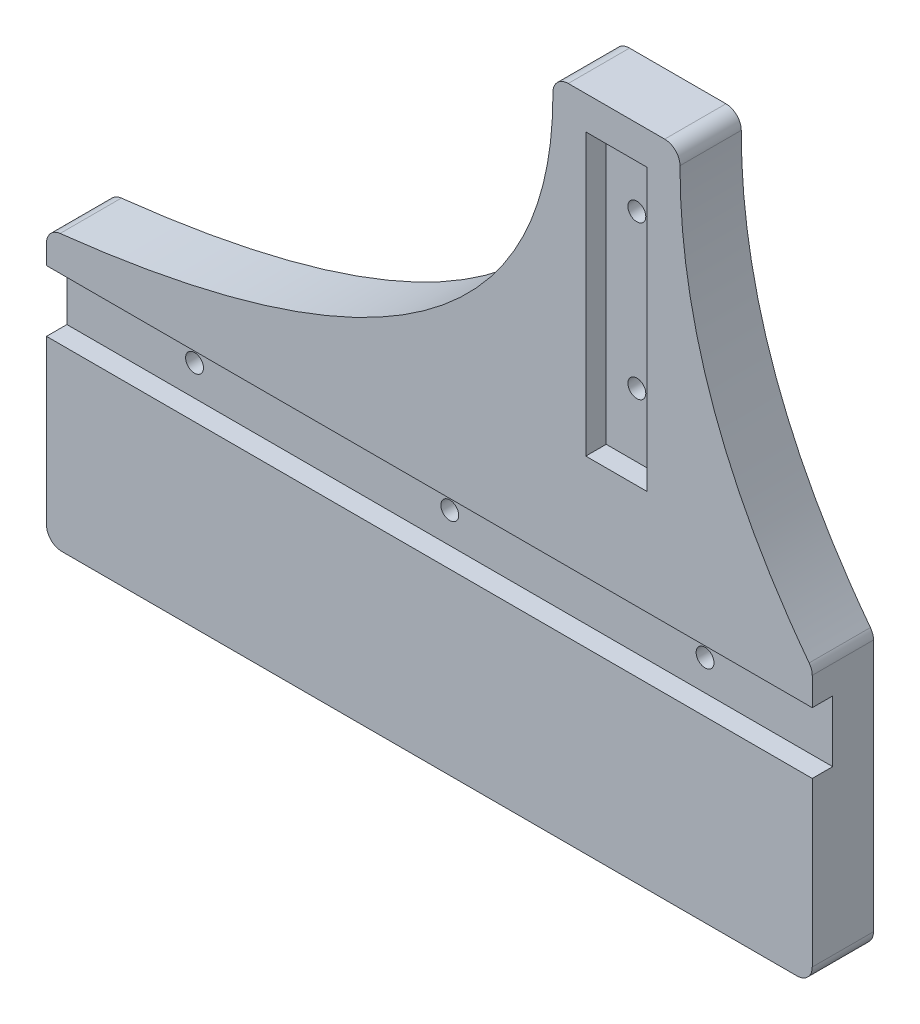
ISO-10303-21;
HEADER;
FILE_DESCRIPTION(('STEP AP214'),'2;1');
FILE_NAME('part.step','',(''),(''),'','','');
FILE_SCHEMA(('AUTOMOTIVE_DESIGN { 1 0 10303 214 1 1 1 1 }'));
ENDSEC;
DATA;
#1=APPLICATION_CONTEXT('core data for automotive mechanical design processes');
#2=APPLICATION_PROTOCOL_DEFINITION('international standard','automotive_design',2000,#1);
#3=PRODUCT_CONTEXT('',#1,'mechanical');
#4=PRODUCT('Part','Part','',(#3));
#5=PRODUCT_RELATED_PRODUCT_CATEGORY('part','',(#4));
#6=PRODUCT_DEFINITION_FORMATION('','',#4);
#7=PRODUCT_DEFINITION_CONTEXT('part definition',#1,'design');
#8=PRODUCT_DEFINITION('design','',#6,#7);
#9=PRODUCT_DEFINITION_SHAPE('','',#8);
#10=(LENGTH_UNIT() NAMED_UNIT(*) SI_UNIT(.MILLI.,.METRE.));
#11=(NAMED_UNIT(*) PLANE_ANGLE_UNIT() SI_UNIT($,.RADIAN.));
#12=(NAMED_UNIT(*) SI_UNIT($,.STERADIAN.) SOLID_ANGLE_UNIT());
#13=UNCERTAINTY_MEASURE_WITH_UNIT(LENGTH_MEASURE(1.E-05),#10,'distance_accuracy_value','');
#14=(GEOMETRIC_REPRESENTATION_CONTEXT(3) GLOBAL_UNCERTAINTY_ASSIGNED_CONTEXT((#13)) GLOBAL_UNIT_ASSIGNED_CONTEXT((#10,
#11,#12)) REPRESENTATION_CONTEXT('',''));
#15=CARTESIAN_POINT('',(0.,0.,0.));
#16=DIRECTION('',(0.,0.,1.));
#17=DIRECTION('',(1.,0.,0.));
#18=AXIS2_PLACEMENT_3D('',#15,#16,#17);
#19=CARTESIAN_POINT('',(36.64,69.,-12.));
#20=DIRECTION('',(0.,0.,1.));
#21=DIRECTION('',(1.,0.,0.));
#22=AXIS2_PLACEMENT_3D('',#19,#20,#21);
#23=CYLINDRICAL_SURFACE('',#22,1.75);
#24=CARTESIAN_POINT('',(36.64,69.,-12.));
#25=DIRECTION('',(0.,0.,1.));
#26=DIRECTION('',(1.,0.,0.));
#27=AXIS2_PLACEMENT_3D('',#24,#25,#26);
#28=CIRCLE('',#27,1.75);
#29=CARTESIAN_POINT('',(38.39,69.,-12.));
#30=VERTEX_POINT('',#29);
#31=EDGE_CURVE('E352',#30,#30,#28,.T.);
#32=ORIENTED_EDGE('',*,*,#31,.F.);
#33=EDGE_LOOP('',(#32));
#34=FACE_BOUND('',#33,.T.);
#35=CARTESIAN_POINT('',(36.64,69.,-4.));
#36=DIRECTION('',(0.,0.,1.));
#37=DIRECTION('',(1.,0.,0.));
#38=AXIS2_PLACEMENT_3D('',#35,#36,#37);
#39=CIRCLE('',#38,1.75);
#40=CARTESIAN_POINT('',(38.39,69.,-4.));
#41=VERTEX_POINT('',#40);
#42=EDGE_CURVE('E199',#41,#41,#39,.T.);
#43=ORIENTED_EDGE('',*,*,#42,.T.);
#44=EDGE_LOOP('',(#43));
#45=FACE_BOUND('',#44,.T.);
#46=ADVANCED_FACE('F37',(#34,#45),#23,.F.);
#47=CARTESIAN_POINT('',(36.64,39.,-12.));
#48=DIRECTION('',(0.,0.,1.));
#49=DIRECTION('',(1.,0.,0.));
#50=AXIS2_PLACEMENT_3D('',#47,#48,#49);
#51=CYLINDRICAL_SURFACE('',#50,1.75);
#52=CARTESIAN_POINT('',(36.64,39.,-12.));
#53=DIRECTION('',(0.,0.,1.));
#54=DIRECTION('',(1.,0.,0.));
#55=AXIS2_PLACEMENT_3D('',#52,#53,#54);
#56=CIRCLE('',#55,1.75);
#57=CARTESIAN_POINT('',(38.39,39.,-12.));
#58=VERTEX_POINT('',#57);
#59=EDGE_CURVE('E349',#58,#58,#56,.T.);
#60=ORIENTED_EDGE('',*,*,#59,.F.);
#61=EDGE_LOOP('',(#60));
#62=FACE_BOUND('',#61,.T.);
#63=CARTESIAN_POINT('',(36.64,39.,-4.));
#64=DIRECTION('',(0.,0.,1.));
#65=DIRECTION('',(1.,0.,0.));
#66=AXIS2_PLACEMENT_3D('',#63,#64,#65);
#67=CIRCLE('',#66,1.75);
#68=CARTESIAN_POINT('',(38.39,39.,-4.));
#69=VERTEX_POINT('',#68);
#70=EDGE_CURVE('E202',#69,#69,#67,.T.);
#71=ORIENTED_EDGE('',*,*,#70,.T.);
#72=EDGE_LOOP('',(#71));
#73=FACE_BOUND('',#72,.T.);
#74=ADVANCED_FACE('F303',(#62,#73),#51,.F.);
#75=CARTESIAN_POINT('',(0.,0.,0.));
#76=DIRECTION('',(0.,0.,1.));
#77=DIRECTION('',(1.,0.,0.));
#78=AXIS2_PLACEMENT_3D('',#75,#76,#77);
#79=PLANE('',#78);
#80=DIRECTION('',(0.,-1.,0.));
#81=VECTOR('',#80,1.);
#82=CARTESIAN_POINT('',(75.,0.,0.));
#83=LINE('',#82,#81);
#84=CARTESIAN_POINT('',(75.,11.4873755573327,0.));
#85=VERTEX_POINT('',#84);
#86=CARTESIAN_POINT('',(75.,6.00000000000002,0.));
#87=VERTEX_POINT('',#86);
#88=EDGE_CURVE('E265',#85,#87,#83,.T.);
#89=ORIENTED_EDGE('',*,*,#88,.F.);
#90=CARTESIAN_POINT('',(72.0000000000001,11.4873755573327,0.));
#91=DIRECTION('',(0.,0.,1.));
#92=DIRECTION('',(1.,0.,0.));
#93=AXIS2_PLACEMENT_3D('',#90,#91,#92);
#94=CIRCLE('',#93,3.);
#95=CARTESIAN_POINT('',(74.3922031068026,13.2977247766282,0.));
#96=VERTEX_POINT('',#95);
#97=EDGE_CURVE('E421',#85,#96,#94,.T.);
#98=ORIENTED_EDGE('',*,*,#97,.T.);
#99=CARTESIAN_POINT('',(49.14,88.,0.));
#100=CARTESIAN_POINT('',(47.9994288545833,47.6999038838313,0.));
#101=CARTESIAN_POINT('',(75.,12.5,0.));
#102=B_SPLINE_CURVE_WITH_KNOTS('',2,(#99,#100,#101),.UNSPECIFIED.,.F.,.F.,(3,3),(0.,1.),.UNSPECIFIED.);
#103=CARTESIAN_POINT('',(49.0940495349071,84.9933925839309,0.));
#104=VERTEX_POINT('',#103);
#105=EDGE_CURVE('E257',#104,#96,#102,.T.);
#106=ORIENTED_EDGE('',*,*,#105,.F.);
#107=CARTESIAN_POINT('',(46.0940568112405,85.,0.));
#108=DIRECTION('',(0.,0.,1.));
#109=DIRECTION('',(1.,0.,0.));
#110=AXIS2_PLACEMENT_3D('',#107,#108,#109);
#111=CIRCLE('',#110,3.);
#112=CARTESIAN_POINT('',(46.0940568112405,88.,0.));
#113=VERTEX_POINT('',#112);
#114=EDGE_CURVE('E419',#104,#113,#111,.T.);
#115=ORIENTED_EDGE('',*,*,#114,.T.);
#116=DIRECTION('',(1.,0.,0.));
#117=VECTOR('',#116,1.);
#118=CARTESIAN_POINT('',(0.,88.,0.));
#119=LINE('',#118,#117);
#120=CARTESIAN_POINT('',(27.2076035945309,88.,0.));
#121=VERTEX_POINT('',#120);
#122=EDGE_CURVE('E369',#121,#113,#119,.T.);
#123=ORIENTED_EDGE('',*,*,#122,.F.);
#124=CARTESIAN_POINT('',(27.2076035945309,85.0000000000001,0.));
#125=DIRECTION('',(0.,0.,1.));
#126=DIRECTION('',(1.,0.,0.));
#127=AXIS2_PLACEMENT_3D('',#124,#125,#126);
#128=CIRCLE('',#127,3.);
#129=CARTESIAN_POINT('',(24.2076223523409,84.9893912060904,0.));
#130=VERTEX_POINT('',#129);
#131=EDGE_CURVE('E59',#121,#130,#128,.T.);
#132=ORIENTED_EDGE('',*,*,#131,.T.);
#133=CARTESIAN_POINT('',(24.14,88.,0.));
#134=CARTESIAN_POINT('',(26.8075250425596,22.9625614657823,0.));
#135=CARTESIAN_POINT('',(-75.,12.5,0.));
#136=B_SPLINE_CURVE_WITH_KNOTS('',2,(#133,#134,#135),.UNSPECIFIED.,.F.,.F.,(3,3),(0.,1.),.UNSPECIFIED.);
#137=CARTESIAN_POINT('',(-72.3319906743855,12.7855531005077,0.));
#138=VERTEX_POINT('',#137);
#139=EDGE_CURVE('E375',#130,#138,#136,.T.);
#140=ORIENTED_EDGE('',*,*,#139,.T.);
#141=CARTESIAN_POINT('',(-72.,9.80397932276527,0.));
#142=DIRECTION('',(0.,0.,1.));
#143=DIRECTION('',(1.,0.,0.));
#144=AXIS2_PLACEMENT_3D('',#141,#142,#143);
#145=CIRCLE('',#144,3.);
#146=CARTESIAN_POINT('',(-75.,9.80397932276527,0.));
#147=VERTEX_POINT('',#146);
#148=EDGE_CURVE('E52',#138,#147,#145,.T.);
#149=ORIENTED_EDGE('',*,*,#148,.T.);
#150=DIRECTION('',(0.,1.,0.));
#151=VECTOR('',#150,1.);
#152=CARTESIAN_POINT('',(-75.,0.,0.));
#153=LINE('',#152,#151);
#154=CARTESIAN_POINT('',(-75.,6.00000000000002,0.));
#155=VERTEX_POINT('',#154);
#156=EDGE_CURVE('E379',#155,#147,#153,.T.);
#157=ORIENTED_EDGE('',*,*,#156,.F.);
#158=DIRECTION('',(1.,0.,0.));
#159=VECTOR('',#158,1.);
#160=CARTESIAN_POINT('',(-75.,6.00000000000002,0.));
#161=LINE('',#160,#159);
#162=EDGE_CURVE('E237',#155,#87,#161,.T.);
#163=ORIENTED_EDGE('',*,*,#162,.T.);
#164=EDGE_LOOP('',(#89,#98,#106,#115,#123,#132,#140,#149,#157,#163));
#165=FACE_BOUND('',#164,.T.);
#166=DIRECTION('',(1.,0.,0.));
#167=VECTOR('',#166,1.);
#168=CARTESIAN_POINT('',(0.,81.5,0.));
#169=LINE('',#168,#167);
#170=CARTESIAN_POINT('',(30.64,81.5,0.));
#171=VERTEX_POINT('',#170);
#172=CARTESIAN_POINT('',(42.64,81.5,0.));
#173=VERTEX_POINT('',#172);
#174=EDGE_CURVE('E209',#171,#173,#169,.T.);
#175=ORIENTED_EDGE('',*,*,#174,.T.);
#176=DIRECTION('',(0.,-1.,0.));
#177=VECTOR('',#176,1.);
#178=CARTESIAN_POINT('',(42.64,0.,0.));
#179=LINE('',#178,#177);
#180=CARTESIAN_POINT('',(42.64,26.5,0.));
#181=VERTEX_POINT('',#180);
#182=EDGE_CURVE('E193',#173,#181,#179,.T.);
#183=ORIENTED_EDGE('',*,*,#182,.T.);
#184=DIRECTION('',(1.,0.,0.));
#185=VECTOR('',#184,1.);
#186=CARTESIAN_POINT('',(0.,26.5,0.));
#187=LINE('',#186,#185);
#188=CARTESIAN_POINT('',(30.64,26.5,0.));
#189=VERTEX_POINT('',#188);
#190=EDGE_CURVE('E215',#189,#181,#187,.T.);
#191=ORIENTED_EDGE('',*,*,#190,.F.);
#192=DIRECTION('',(0.,-1.,0.));
#193=VECTOR('',#192,1.);
#194=CARTESIAN_POINT('',(30.64,0.,0.));
#195=LINE('',#194,#193);
#196=EDGE_CURVE('E212',#171,#189,#195,.T.);
#197=ORIENTED_EDGE('',*,*,#196,.F.);
#198=EDGE_LOOP('',(#175,#183,#191,#197));
#199=FACE_BOUND('',#198,.T.);
#200=ADVANCED_FACE('F276',(#165,#199),#79,.T.);
#201=CARTESIAN_POINT('',(49.14,88.,-12.));
#202=CARTESIAN_POINT('',(47.9994288545833,47.6999038838313,-12.));
#203=CARTESIAN_POINT('',(75.,12.5,-12.));
#204=B_SPLINE_CURVE_WITH_KNOTS('',2,(#201,#202,#203),.UNSPECIFIED.,.F.,.F.,(3,3),(0.,1.),.UNSPECIFIED.);
#205=DIRECTION('',(0.,0.,1.));
#206=VECTOR('',#205,1.);
#207=SURFACE_OF_LINEAR_EXTRUSION('',#204,#206);
#208=ORIENTED_EDGE('',*,*,#105,.T.);
#209=DIRECTION('',(0.,0.,1.));
#210=VECTOR('',#209,1.);
#211=CARTESIAN_POINT('',(74.3922031068026,13.2977247766282,0.));
#212=LINE('',#211,#210);
#213=CARTESIAN_POINT('',(74.3922031068026,13.2977247766282,-12.));
#214=VERTEX_POINT('',#213);
#215=EDGE_CURVE('E426',#96,#214,#212,.F.);
#216=ORIENTED_EDGE('',*,*,#215,.T.);
#217=CARTESIAN_POINT('',(49.0940495349071,84.9933925839309,-12.));
#218=VERTEX_POINT('',#217);
#219=EDGE_CURVE('E258',#218,#214,#204,.T.);
#220=ORIENTED_EDGE('',*,*,#219,.F.);
#221=DIRECTION('',(0.,0.,1.));
#222=VECTOR('',#221,1.);
#223=CARTESIAN_POINT('',(49.0940495349071,84.993392583931,-12.));
#224=LINE('',#223,#222);
#225=EDGE_CURVE('E423',#218,#104,#224,.T.);
#226=ORIENTED_EDGE('',*,*,#225,.T.);
#227=EDGE_LOOP('',(#208,#216,#220,#226));
#228=FACE_BOUND('',#227,.T.);
#229=ADVANCED_FACE('F271',(#228),#207,.F.);
#230=CARTESIAN_POINT('',(75.,0.,-12.));
#231=DIRECTION('',(-1.,0.,0.));
#232=DIRECTION('',(0.,0.,1.));
#233=AXIS2_PLACEMENT_3D('',#230,#231,#232);
#234=PLANE('',#233);
#235=CARTESIAN_POINT('',(75.,-5.99999999999999,0.));
#236=VERTEX_POINT('',#235);
#237=CARTESIAN_POINT('',(75.,-38.,0.));
#238=VERTEX_POINT('',#237);
#239=EDGE_CURVE('E388',#236,#238,#83,.T.);
#240=ORIENTED_EDGE('',*,*,#239,.T.);
#241=DIRECTION('',(0.,0.,1.));
#242=VECTOR('',#241,1.);
#243=CARTESIAN_POINT('',(75.,-38.,-12.));
#244=LINE('',#243,#242);
#245=CARTESIAN_POINT('',(75.,-38.,-12.));
#246=VERTEX_POINT('',#245);
#247=EDGE_CURVE('E403',#238,#246,#244,.F.);
#248=ORIENTED_EDGE('',*,*,#247,.T.);
#249=DIRECTION('',(0.,-1.,0.));
#250=VECTOR('',#249,1.);
#251=CARTESIAN_POINT('',(75.,0.,-12.));
#252=LINE('',#251,#250);
#253=CARTESIAN_POINT('',(75.,11.4873755573327,-12.));
#254=VERTEX_POINT('',#253);
#255=EDGE_CURVE('E346',#254,#246,#252,.T.);
#256=ORIENTED_EDGE('',*,*,#255,.F.);
#257=DIRECTION('',(0.,0.,1.));
#258=VECTOR('',#257,1.);
#259=CARTESIAN_POINT('',(75.,11.4873755573327,-12.));
#260=LINE('',#259,#258);
#261=EDGE_CURVE('E400',#254,#85,#260,.T.);
#262=ORIENTED_EDGE('',*,*,#261,.T.);
#263=ORIENTED_EDGE('',*,*,#88,.T.);
#264=DIRECTION('',(0.,0.,1.));
#265=VECTOR('',#264,1.);
#266=CARTESIAN_POINT('',(75.,6.00000000000002,-4.));
#267=LINE('',#266,#265);
#268=CARTESIAN_POINT('',(75.,6.00000000000002,-4.));
#269=VERTEX_POINT('',#268);
#270=EDGE_CURVE('E228',#269,#87,#267,.T.);
#271=ORIENTED_EDGE('',*,*,#270,.F.);
#272=DIRECTION('',(0.,-1.,0.));
#273=VECTOR('',#272,1.);
#274=CARTESIAN_POINT('',(75.,6.00000000000002,-4.));
#275=LINE('',#274,#273);
#276=CARTESIAN_POINT('',(75.,-5.99999999999999,-4.));
#277=VERTEX_POINT('',#276);
#278=EDGE_CURVE('E246',#269,#277,#275,.T.);
#279=ORIENTED_EDGE('',*,*,#278,.T.);
#280=DIRECTION('',(0.,0.,1.));
#281=VECTOR('',#280,1.);
#282=CARTESIAN_POINT('',(75.,-5.99999999999999,-4.));
#283=LINE('',#282,#281);
#284=EDGE_CURVE('E224',#277,#236,#283,.T.);
#285=ORIENTED_EDGE('',*,*,#284,.T.);
#286=EDGE_LOOP('',(#240,#248,#256,#262,#263,#271,#279,#285));
#287=FACE_BOUND('',#286,.T.);
#288=ADVANCED_FACE('F275',(#287),#234,.F.);
#289=CARTESIAN_POINT('',(0.,-41.,-12.));
#290=DIRECTION('',(0.,1.,0.));
#291=DIRECTION('',(0.,0.,1.));
#292=AXIS2_PLACEMENT_3D('',#289,#290,#291);
#293=PLANE('',#292);
#294=DIRECTION('',(-1.,0.,0.));
#295=VECTOR('',#294,1.);
#296=CARTESIAN_POINT('',(0.,-41.,-12.));
#297=LINE('',#296,#295);
#298=CARTESIAN_POINT('',(72.,-41.,-12.));
#299=VERTEX_POINT('',#298);
#300=CARTESIAN_POINT('',(-72.,-41.,-12.));
#301=VERTEX_POINT('',#300);
#302=EDGE_CURVE('E343',#299,#301,#297,.T.);
#303=ORIENTED_EDGE('',*,*,#302,.F.);
#304=DIRECTION('',(0.,0.,1.));
#305=VECTOR('',#304,1.);
#306=CARTESIAN_POINT('',(72.,-41.,-12.));
#307=LINE('',#306,#305);
#308=CARTESIAN_POINT('',(72.,-41.,0.));
#309=VERTEX_POINT('',#308);
#310=EDGE_CURVE('E393',#299,#309,#307,.T.);
#311=ORIENTED_EDGE('',*,*,#310,.T.);
#312=DIRECTION('',(-1.,0.,0.));
#313=VECTOR('',#312,1.);
#314=CARTESIAN_POINT('',(0.,-41.,0.));
#315=LINE('',#314,#313);
#316=CARTESIAN_POINT('',(-72.,-41.,0.));
#317=VERTEX_POINT('',#316);
#318=EDGE_CURVE('E385',#309,#317,#315,.T.);
#319=ORIENTED_EDGE('',*,*,#318,.T.);
#320=DIRECTION('',(0.,0.,1.));
#321=VECTOR('',#320,1.);
#322=CARTESIAN_POINT('',(-72.,-41.,-12.));
#323=LINE('',#322,#321);
#324=EDGE_CURVE('E364',#317,#301,#323,.F.);
#325=ORIENTED_EDGE('',*,*,#324,.T.);
#326=EDGE_LOOP('',(#303,#311,#319,#325));
#327=FACE_BOUND('',#326,.T.);
#328=ADVANCED_FACE('F319',(#327),#293,.F.);
#329=CARTESIAN_POINT('',(-75.,0.,-12.));
#330=DIRECTION('',(1.,0.,0.));
#331=DIRECTION('',(0.,0.,-1.));
#332=AXIS2_PLACEMENT_3D('',#329,#330,#331);
#333=PLANE('',#332);
#334=DIRECTION('',(0.,1.,0.));
#335=VECTOR('',#334,1.);
#336=CARTESIAN_POINT('',(-75.,0.,-12.));
#337=LINE('',#336,#335);
#338=CARTESIAN_POINT('',(-75.,-38.,-12.));
#339=VERTEX_POINT('',#338);
#340=CARTESIAN_POINT('',(-75.,9.80397932276527,-12.));
#341=VERTEX_POINT('',#340);
#342=EDGE_CURVE('E337',#339,#341,#337,.T.);
#343=ORIENTED_EDGE('',*,*,#342,.F.);
#344=DIRECTION('',(0.,0.,1.));
#345=VECTOR('',#344,1.);
#346=CARTESIAN_POINT('',(-75.,-38.,-12.));
#347=LINE('',#346,#345);
#348=CARTESIAN_POINT('',(-75.,-38.,0.));
#349=VERTEX_POINT('',#348);
#350=EDGE_CURVE('E435',#339,#349,#347,.T.);
#351=ORIENTED_EDGE('',*,*,#350,.T.);
#352=CARTESIAN_POINT('',(-75.,-5.99999999999999,0.));
#353=VERTEX_POINT('',#352);
#354=EDGE_CURVE('E380',#349,#353,#153,.T.);
#355=ORIENTED_EDGE('',*,*,#354,.T.);
#356=DIRECTION('',(0.,0.,1.));
#357=VECTOR('',#356,1.);
#358=CARTESIAN_POINT('',(-75.,-5.99999999999999,-4.));
#359=LINE('',#358,#357);
#360=CARTESIAN_POINT('',(-75.,-5.99999999999999,-4.));
#361=VERTEX_POINT('',#360);
#362=EDGE_CURVE('E234',#361,#353,#359,.T.);
#363=ORIENTED_EDGE('',*,*,#362,.F.);
#364=DIRECTION('',(0.,-1.,0.));
#365=VECTOR('',#364,1.);
#366=CARTESIAN_POINT('',(-75.,6.00000000000002,-4.));
#367=LINE('',#366,#365);
#368=CARTESIAN_POINT('',(-75.,6.00000000000002,-4.));
#369=VERTEX_POINT('',#368);
#370=EDGE_CURVE('E227',#369,#361,#367,.T.);
#371=ORIENTED_EDGE('',*,*,#370,.F.);
#372=DIRECTION('',(0.,0.,1.));
#373=VECTOR('',#372,1.);
#374=CARTESIAN_POINT('',(-75.,6.00000000000002,-4.));
#375=LINE('',#374,#373);
#376=EDGE_CURVE('E231',#369,#155,#375,.T.);
#377=ORIENTED_EDGE('',*,*,#376,.T.);
#378=ORIENTED_EDGE('',*,*,#156,.T.);
#379=DIRECTION('',(0.,0.,-1.));
#380=VECTOR('',#379,1.);
#381=CARTESIAN_POINT('',(-75.,9.80397932276527,-12.));
#382=LINE('',#381,#380);
#383=EDGE_CURVE('E433',#147,#341,#382,.T.);
#384=ORIENTED_EDGE('',*,*,#383,.T.);
#385=EDGE_LOOP('',(#343,#351,#355,#363,#371,#377,#378,#384));
#386=FACE_BOUND('',#385,.T.);
#387=ADVANCED_FACE('F323',(#386),#333,.F.);
#388=CARTESIAN_POINT('',(24.14,88.,-12.));
#389=CARTESIAN_POINT('',(26.8075250425596,22.9625614657823,-12.));
#390=CARTESIAN_POINT('',(-75.,12.5,-12.));
#391=B_SPLINE_CURVE_WITH_KNOTS('',2,(#388,#389,#390),.UNSPECIFIED.,.F.,.F.,(3,3),(0.,1.),.UNSPECIFIED.);
#392=DIRECTION('',(0.,0.,1.));
#393=VECTOR('',#392,1.);
#394=SURFACE_OF_LINEAR_EXTRUSION('',#391,#393);
#395=CARTESIAN_POINT('',(24.2076223523409,84.9893912060904,-12.));
#396=VERTEX_POINT('',#395);
#397=CARTESIAN_POINT('',(-72.3319906743855,12.7855531005077,-12.));
#398=VERTEX_POINT('',#397);
#399=EDGE_CURVE('E331',#396,#398,#391,.T.);
#400=ORIENTED_EDGE('',*,*,#399,.T.);
#401=DIRECTION('',(0.,0.,1.));
#402=VECTOR('',#401,1.);
#403=CARTESIAN_POINT('',(-72.3319906743832,12.7855531005079,-12.));
#404=LINE('',#403,#402);
#405=EDGE_CURVE('E11',#398,#138,#404,.T.);
#406=ORIENTED_EDGE('',*,*,#405,.T.);
#407=ORIENTED_EDGE('',*,*,#139,.F.);
#408=DIRECTION('',(0.,0.,1.));
#409=VECTOR('',#408,1.);
#410=CARTESIAN_POINT('',(24.2076223523409,84.9893912060904,0.));
#411=LINE('',#410,#409);
#412=EDGE_CURVE('E45',#130,#396,#411,.F.);
#413=ORIENTED_EDGE('',*,*,#412,.T.);
#414=EDGE_LOOP('',(#400,#406,#407,#413));
#415=FACE_BOUND('',#414,.T.);
#416=ADVANCED_FACE('F326',(#415),#394,.T.);
#417=CARTESIAN_POINT('',(0.,0.,-12.));
#418=DIRECTION('',(0.,0.,1.));
#419=DIRECTION('',(1.,0.,0.));
#420=AXIS2_PLACEMENT_3D('',#417,#418,#419);
#421=CYLINDRICAL_SURFACE('',#420,1.75);
#422=CARTESIAN_POINT('',(0.,0.,-4.));
#423=DIRECTION('',(0.,0.,-1.));
#424=DIRECTION('',(-1.,0.,0.));
#425=AXIS2_PLACEMENT_3D('',#422,#423,#424);
#426=CIRCLE('',#425,1.75);
#427=CARTESIAN_POINT('',(-1.75,0.,-4.));
#428=VERTEX_POINT('',#427);
#429=EDGE_CURVE('E254',#428,#428,#426,.F.);
#430=ORIENTED_EDGE('',*,*,#429,.T.);
#431=EDGE_LOOP('',(#430));
#432=FACE_BOUND('',#431,.T.);
#433=CARTESIAN_POINT('',(0.,0.,-12.));
#434=DIRECTION('',(0.,0.,1.));
#435=DIRECTION('',(1.,0.,0.));
#436=AXIS2_PLACEMENT_3D('',#433,#434,#435);
#437=CIRCLE('',#436,1.75);
#438=CARTESIAN_POINT('',(1.75,0.,-12.));
#439=VERTEX_POINT('',#438);
#440=EDGE_CURVE('E358',#439,#439,#437,.T.);
#441=ORIENTED_EDGE('',*,*,#440,.F.);
#442=EDGE_LOOP('',(#441));
#443=FACE_BOUND('',#442,.T.);
#444=ADVANCED_FACE('F329',(#432,#443),#421,.F.);
#445=CARTESIAN_POINT('',(50.,0.,-12.));
#446=DIRECTION('',(0.,0.,1.));
#447=DIRECTION('',(1.,0.,0.));
#448=AXIS2_PLACEMENT_3D('',#445,#446,#447);
#449=CYLINDRICAL_SURFACE('',#448,1.75);
#450=CARTESIAN_POINT('',(50.,0.,-4.));
#451=DIRECTION('',(0.,0.,-1.));
#452=DIRECTION('',(-1.,0.,0.));
#453=AXIS2_PLACEMENT_3D('',#450,#451,#452);
#454=CIRCLE('',#453,1.75);
#455=CARTESIAN_POINT('',(48.25,0.,-4.));
#456=VERTEX_POINT('',#455);
#457=EDGE_CURVE('E251',#456,#456,#454,.F.);
#458=ORIENTED_EDGE('',*,*,#457,.T.);
#459=EDGE_LOOP('',(#458));
#460=FACE_BOUND('',#459,.T.);
#461=CARTESIAN_POINT('',(50.,0.,-12.));
#462=DIRECTION('',(0.,0.,1.));
#463=DIRECTION('',(1.,0.,0.));
#464=AXIS2_PLACEMENT_3D('',#461,#462,#463);
#465=CIRCLE('',#464,1.75);
#466=CARTESIAN_POINT('',(51.75,0.,-12.));
#467=VERTEX_POINT('',#466);
#468=EDGE_CURVE('E355',#467,#467,#465,.T.);
#469=ORIENTED_EDGE('',*,*,#468,.F.);
#470=EDGE_LOOP('',(#469));
#471=FACE_BOUND('',#470,.T.);
#472=ADVANCED_FACE('F314',(#460,#471),#449,.F.);
#473=CARTESIAN_POINT('',(0.,88.,-12.));
#474=DIRECTION('',(0.,-1.,0.));
#475=DIRECTION('',(0.,0.,-1.));
#476=AXIS2_PLACEMENT_3D('',#473,#474,#475);
#477=PLANE('',#476);
#478=ORIENTED_EDGE('',*,*,#122,.T.);
#479=DIRECTION('',(0.,0.,1.));
#480=VECTOR('',#479,1.);
#481=CARTESIAN_POINT('',(46.0940568112405,88.,-12.));
#482=LINE('',#481,#480);
#483=CARTESIAN_POINT('',(46.0940568112405,88.,-12.));
#484=VERTEX_POINT('',#483);
#485=EDGE_CURVE('E431',#113,#484,#482,.F.);
#486=ORIENTED_EDGE('',*,*,#485,.T.);
#487=DIRECTION('',(1.,0.,0.));
#488=VECTOR('',#487,1.);
#489=CARTESIAN_POINT('',(0.,88.,-12.));
#490=LINE('',#489,#488);
#491=CARTESIAN_POINT('',(27.2076035945309,88.,-12.));
#492=VERTEX_POINT('',#491);
#493=EDGE_CURVE('E264',#492,#484,#490,.T.);
#494=ORIENTED_EDGE('',*,*,#493,.F.);
#495=DIRECTION('',(0.,0.,-1.));
#496=VECTOR('',#495,1.);
#497=CARTESIAN_POINT('',(27.2076035945309,88.,0.));
#498=LINE('',#497,#496);
#499=EDGE_CURVE('E428',#492,#121,#498,.F.);
#500=ORIENTED_EDGE('',*,*,#499,.T.);
#501=EDGE_LOOP('',(#478,#486,#494,#500));
#502=FACE_BOUND('',#501,.T.);
#503=ADVANCED_FACE('F278',(#502),#477,.F.);
#504=CARTESIAN_POINT('',(-50.,0.,-12.));
#505=DIRECTION('',(0.,0.,1.));
#506=DIRECTION('',(1.,0.,0.));
#507=AXIS2_PLACEMENT_3D('',#504,#505,#506);
#508=CYLINDRICAL_SURFACE('',#507,1.75);
#509=CARTESIAN_POINT('',(-50.,0.,-4.));
#510=DIRECTION('',(0.,0.,-1.));
#511=DIRECTION('',(-1.,0.,0.));
#512=AXIS2_PLACEMENT_3D('',#509,#510,#511);
#513=CIRCLE('',#512,1.75);
#514=CARTESIAN_POINT('',(-51.75,0.,-4.));
#515=VERTEX_POINT('',#514);
#516=EDGE_CURVE('E220',#515,#515,#513,.F.);
#517=ORIENTED_EDGE('',*,*,#516,.T.);
#518=EDGE_LOOP('',(#517));
#519=FACE_BOUND('',#518,.T.);
#520=CARTESIAN_POINT('',(-50.,0.,-12.));
#521=DIRECTION('',(0.,0.,1.));
#522=DIRECTION('',(1.,0.,0.));
#523=AXIS2_PLACEMENT_3D('',#520,#521,#522);
#524=CIRCLE('',#523,1.75);
#525=CARTESIAN_POINT('',(-48.25,0.,-12.));
#526=VERTEX_POINT('',#525);
#527=EDGE_CURVE('E361',#526,#526,#524,.T.);
#528=ORIENTED_EDGE('',*,*,#527,.F.);
#529=EDGE_LOOP('',(#528));
#530=FACE_BOUND('',#529,.T.);
#531=ADVANCED_FACE('F501',(#519,#530),#508,.F.);
#532=CARTESIAN_POINT('',(0.,0.,-12.));
#533=DIRECTION('',(0.,0.,1.));
#534=DIRECTION('',(1.,0.,0.));
#535=AXIS2_PLACEMENT_3D('',#532,#533,#534);
#536=PLANE('',#535);
#537=ORIENTED_EDGE('',*,*,#255,.T.);
#538=CARTESIAN_POINT('',(72.,-38.,-12.));
#539=DIRECTION('',(0.,0.,1.));
#540=DIRECTION('',(1.,0.,0.));
#541=AXIS2_PLACEMENT_3D('',#538,#539,#540);
#542=CIRCLE('',#541,3.);
#543=EDGE_CURVE('E415',#246,#299,#542,.F.);
#544=ORIENTED_EDGE('',*,*,#543,.T.);
#545=ORIENTED_EDGE('',*,*,#302,.T.);
#546=CARTESIAN_POINT('',(-72.,-38.,-12.));
#547=DIRECTION('',(0.,0.,1.));
#548=DIRECTION('',(1.,0.,0.));
#549=AXIS2_PLACEMENT_3D('',#546,#547,#548);
#550=CIRCLE('',#549,3.);
#551=EDGE_CURVE('E409',#301,#339,#550,.F.);
#552=ORIENTED_EDGE('',*,*,#551,.T.);
#553=ORIENTED_EDGE('',*,*,#342,.T.);
#554=CARTESIAN_POINT('',(-72.,9.80397932276527,-12.));
#555=DIRECTION('',(0.,0.,1.));
#556=DIRECTION('',(1.,0.,0.));
#557=AXIS2_PLACEMENT_3D('',#554,#555,#556);
#558=CIRCLE('',#557,3.);
#559=EDGE_CURVE('E407',#341,#398,#558,.F.);
#560=ORIENTED_EDGE('',*,*,#559,.T.);
#561=ORIENTED_EDGE('',*,*,#399,.F.);
#562=CARTESIAN_POINT('',(27.2076035945309,85.0000000000001,-12.));
#563=DIRECTION('',(0.,0.,1.));
#564=DIRECTION('',(1.,0.,0.));
#565=AXIS2_PLACEMENT_3D('',#562,#563,#564);
#566=CIRCLE('',#565,3.);
#567=EDGE_CURVE('E405',#396,#492,#566,.F.);
#568=ORIENTED_EDGE('',*,*,#567,.T.);
#569=ORIENTED_EDGE('',*,*,#493,.T.);
#570=CARTESIAN_POINT('',(46.0940568112405,85.,-12.));
#571=DIRECTION('',(0.,0.,1.));
#572=DIRECTION('',(1.,0.,0.));
#573=AXIS2_PLACEMENT_3D('',#570,#571,#572);
#574=CIRCLE('',#573,3.);
#575=EDGE_CURVE('E411',#484,#218,#574,.F.);
#576=ORIENTED_EDGE('',*,*,#575,.T.);
#577=ORIENTED_EDGE('',*,*,#219,.T.);
#578=CARTESIAN_POINT('',(72.0000000000001,11.4873755573327,-12.));
#579=DIRECTION('',(0.,0.,1.));
#580=DIRECTION('',(1.,0.,0.));
#581=AXIS2_PLACEMENT_3D('',#578,#579,#580);
#582=CIRCLE('',#581,3.);
#583=EDGE_CURVE('E413',#214,#254,#582,.F.);
#584=ORIENTED_EDGE('',*,*,#583,.T.);
#585=EDGE_LOOP('',(#537,#544,#545,#552,#553,#560,#561,#568,#569,#576,#577,#584));
#586=FACE_BOUND('',#585,.T.);
#587=ORIENTED_EDGE('',*,*,#59,.T.);
#588=EDGE_LOOP('',(#587));
#589=FACE_BOUND('',#588,.T.);
#590=ORIENTED_EDGE('',*,*,#31,.T.);
#591=EDGE_LOOP('',(#590));
#592=FACE_BOUND('',#591,.T.);
#593=ORIENTED_EDGE('',*,*,#468,.T.);
#594=EDGE_LOOP('',(#593));
#595=FACE_BOUND('',#594,.T.);
#596=ORIENTED_EDGE('',*,*,#440,.T.);
#597=EDGE_LOOP('',(#596));
#598=FACE_BOUND('',#597,.T.);
#599=ORIENTED_EDGE('',*,*,#527,.T.);
#600=EDGE_LOOP('',(#599));
#601=FACE_BOUND('',#600,.T.);
#602=ADVANCED_FACE('F441',(#586,#589,#592,#595,#598,#601),#536,.F.);
#603=ORIENTED_EDGE('',*,*,#318,.F.);
#604=CARTESIAN_POINT('',(72.,-38.,0.));
#605=DIRECTION('',(0.,0.,1.));
#606=DIRECTION('',(1.,0.,0.));
#607=AXIS2_PLACEMENT_3D('',#604,#605,#606);
#608=CIRCLE('',#607,3.);
#609=EDGE_CURVE('E398',#309,#238,#608,.T.);
#610=ORIENTED_EDGE('',*,*,#609,.T.);
#611=ORIENTED_EDGE('',*,*,#239,.F.);
#612=DIRECTION('',(1.,0.,0.));
#613=VECTOR('',#612,1.);
#614=CARTESIAN_POINT('',(-75.,-5.99999999999999,0.));
#615=LINE('',#614,#613);
#616=EDGE_CURVE('E210',#353,#236,#615,.T.);
#617=ORIENTED_EDGE('',*,*,#616,.F.);
#618=ORIENTED_EDGE('',*,*,#354,.F.);
#619=CARTESIAN_POINT('',(-72.,-38.,0.));
#620=DIRECTION('',(0.,0.,1.));
#621=DIRECTION('',(1.,0.,0.));
#622=AXIS2_PLACEMENT_3D('',#619,#620,#621);
#623=CIRCLE('',#622,3.);
#624=EDGE_CURVE('E396',#349,#317,#623,.T.);
#625=ORIENTED_EDGE('',*,*,#624,.T.);
#626=EDGE_LOOP('',(#603,#610,#611,#617,#618,#625));
#627=FACE_BOUND('',#626,.T.);
#628=ADVANCED_FACE('F478',(#627),#79,.T.);
#629=CARTESIAN_POINT('',(0.,0.,-4.));
#630=DIRECTION('',(0.,0.,-1.));
#631=DIRECTION('',(-1.,0.,0.));
#632=AXIS2_PLACEMENT_3D('',#629,#630,#631);
#633=PLANE('',#632);
#634=ORIENTED_EDGE('',*,*,#457,.F.);
#635=EDGE_LOOP('',(#634));
#636=FACE_BOUND('',#635,.T.);
#637=DIRECTION('',(1.,0.,0.));
#638=VECTOR('',#637,1.);
#639=CARTESIAN_POINT('',(-75.,-5.99999999999999,-4.));
#640=LINE('',#639,#638);
#641=EDGE_CURVE('E240',#361,#277,#640,.T.);
#642=ORIENTED_EDGE('',*,*,#641,.T.);
#643=ORIENTED_EDGE('',*,*,#278,.F.);
#644=DIRECTION('',(1.,0.,0.));
#645=VECTOR('',#644,1.);
#646=CARTESIAN_POINT('',(-75.,6.00000000000002,-4.));
#647=LINE('',#646,#645);
#648=EDGE_CURVE('E244',#369,#269,#647,.T.);
#649=ORIENTED_EDGE('',*,*,#648,.F.);
#650=ORIENTED_EDGE('',*,*,#370,.T.);
#651=EDGE_LOOP('',(#642,#643,#649,#650));
#652=FACE_BOUND('',#651,.T.);
#653=ORIENTED_EDGE('',*,*,#516,.F.);
#654=EDGE_LOOP('',(#653));
#655=FACE_BOUND('',#654,.T.);
#656=ORIENTED_EDGE('',*,*,#429,.F.);
#657=EDGE_LOOP('',(#656));
#658=FACE_BOUND('',#657,.T.);
#659=ADVANCED_FACE('F469',(#636,#652,#655,#658),#633,.F.);
#660=CARTESIAN_POINT('',(-75.,-5.99999999999999,-4.));
#661=DIRECTION('',(0.,-1.,0.));
#662=DIRECTION('',(0.,0.,-1.));
#663=AXIS2_PLACEMENT_3D('',#660,#661,#662);
#664=PLANE('',#663);
#665=ORIENTED_EDGE('',*,*,#616,.T.);
#666=ORIENTED_EDGE('',*,*,#284,.F.);
#667=ORIENTED_EDGE('',*,*,#641,.F.);
#668=ORIENTED_EDGE('',*,*,#362,.T.);
#669=EDGE_LOOP('',(#665,#666,#667,#668));
#670=FACE_BOUND('',#669,.T.);
#671=ADVANCED_FACE('F486',(#670),#664,.F.);
#672=CARTESIAN_POINT('',(-75.,6.00000000000002,-4.));
#673=DIRECTION('',(0.,-1.,0.));
#674=DIRECTION('',(0.,0.,-1.));
#675=AXIS2_PLACEMENT_3D('',#672,#673,#674);
#676=PLANE('',#675);
#677=ORIENTED_EDGE('',*,*,#162,.F.);
#678=ORIENTED_EDGE('',*,*,#376,.F.);
#679=ORIENTED_EDGE('',*,*,#648,.T.);
#680=ORIENTED_EDGE('',*,*,#270,.T.);
#681=EDGE_LOOP('',(#677,#678,#679,#680));
#682=FACE_BOUND('',#681,.T.);
#683=ADVANCED_FACE('F463',(#682),#676,.T.);
#684=CARTESIAN_POINT('',(42.64,0.,-4.));
#685=DIRECTION('',(-1.,0.,0.));
#686=DIRECTION('',(0.,-1.,0.));
#687=AXIS2_PLACEMENT_3D('',#684,#685,#686);
#688=PLANE('',#687);
#689=ORIENTED_EDGE('',*,*,#182,.F.);
#690=DIRECTION('',(0.,0.,1.));
#691=VECTOR('',#690,1.);
#692=CARTESIAN_POINT('',(42.64,81.5,-4.));
#693=LINE('',#692,#691);
#694=CARTESIAN_POINT('',(42.64,81.5,-4.));
#695=VERTEX_POINT('',#694);
#696=EDGE_CURVE('E179',#695,#173,#693,.T.);
#697=ORIENTED_EDGE('',*,*,#696,.F.);
#698=DIRECTION('',(0.,-1.,0.));
#699=VECTOR('',#698,1.);
#700=CARTESIAN_POINT('',(42.64,0.,-4.));
#701=LINE('',#700,#699);
#702=CARTESIAN_POINT('',(42.64,26.5,-4.));
#703=VERTEX_POINT('',#702);
#704=EDGE_CURVE('E187',#695,#703,#701,.T.);
#705=ORIENTED_EDGE('',*,*,#704,.T.);
#706=DIRECTION('',(0.,0.,1.));
#707=VECTOR('',#706,1.);
#708=CARTESIAN_POINT('',(42.64,26.5,-4.));
#709=LINE('',#708,#707);
#710=EDGE_CURVE('E218',#703,#181,#709,.T.);
#711=ORIENTED_EDGE('',*,*,#710,.T.);
#712=EDGE_LOOP('',(#689,#697,#705,#711));
#713=FACE_BOUND('',#712,.T.);
#714=ADVANCED_FACE('F190',(#713),#688,.T.);
#715=CARTESIAN_POINT('',(0.,26.5,-4.));
#716=DIRECTION('',(0.,-1.,0.));
#717=DIRECTION('',(0.,0.,-1.));
#718=AXIS2_PLACEMENT_3D('',#715,#716,#717);
#719=PLANE('',#718);
#720=ORIENTED_EDGE('',*,*,#190,.T.);
#721=ORIENTED_EDGE('',*,*,#710,.F.);
#722=DIRECTION('',(1.,0.,0.));
#723=VECTOR('',#722,1.);
#724=CARTESIAN_POINT('',(0.,26.5,-4.));
#725=LINE('',#724,#723);
#726=CARTESIAN_POINT('',(30.64,26.5,-4.));
#727=VERTEX_POINT('',#726);
#728=EDGE_CURVE('E194',#727,#703,#725,.T.);
#729=ORIENTED_EDGE('',*,*,#728,.F.);
#730=DIRECTION('',(0.,0.,1.));
#731=VECTOR('',#730,1.);
#732=CARTESIAN_POINT('',(30.64,26.5,-4.));
#733=LINE('',#732,#731);
#734=EDGE_CURVE('E221',#727,#189,#733,.T.);
#735=ORIENTED_EDGE('',*,*,#734,.T.);
#736=EDGE_LOOP('',(#720,#721,#729,#735));
#737=FACE_BOUND('',#736,.T.);
#738=ADVANCED_FACE('F567',(#737),#719,.F.);
#739=CARTESIAN_POINT('',(30.64,0.,-4.));
#740=DIRECTION('',(-1.,0.,0.));
#741=DIRECTION('',(0.,-1.,0.));
#742=AXIS2_PLACEMENT_3D('',#739,#740,#741);
#743=PLANE('',#742);
#744=ORIENTED_EDGE('',*,*,#196,.T.);
#745=ORIENTED_EDGE('',*,*,#734,.F.);
#746=DIRECTION('',(0.,-1.,0.));
#747=VECTOR('',#746,1.);
#748=CARTESIAN_POINT('',(30.64,0.,-4.));
#749=LINE('',#748,#747);
#750=CARTESIAN_POINT('',(30.64,81.5,-4.));
#751=VERTEX_POINT('',#750);
#752=EDGE_CURVE('E186',#751,#727,#749,.T.);
#753=ORIENTED_EDGE('',*,*,#752,.F.);
#754=DIRECTION('',(0.,0.,1.));
#755=VECTOR('',#754,1.);
#756=CARTESIAN_POINT('',(30.64,81.5,-4.));
#757=LINE('',#756,#755);
#758=EDGE_CURVE('E181',#751,#171,#757,.T.);
#759=ORIENTED_EDGE('',*,*,#758,.T.);
#760=EDGE_LOOP('',(#744,#745,#753,#759));
#761=FACE_BOUND('',#760,.T.);
#762=ADVANCED_FACE('F575',(#761),#743,.F.);
#763=CARTESIAN_POINT('',(0.,81.5,-4.));
#764=DIRECTION('',(0.,-1.,0.));
#765=DIRECTION('',(0.,0.,-1.));
#766=AXIS2_PLACEMENT_3D('',#763,#764,#765);
#767=PLANE('',#766);
#768=ORIENTED_EDGE('',*,*,#174,.F.);
#769=ORIENTED_EDGE('',*,*,#758,.F.);
#770=DIRECTION('',(1.,0.,0.));
#771=VECTOR('',#770,1.);
#772=CARTESIAN_POINT('',(0.,81.5,-4.));
#773=LINE('',#772,#771);
#774=EDGE_CURVE('E175',#751,#695,#773,.T.);
#775=ORIENTED_EDGE('',*,*,#774,.T.);
#776=ORIENTED_EDGE('',*,*,#696,.T.);
#777=EDGE_LOOP('',(#768,#769,#775,#776));
#778=FACE_BOUND('',#777,.T.);
#779=ADVANCED_FACE('F178',(#778),#767,.T.);
#780=CARTESIAN_POINT('',(0.,0.,-4.));
#781=DIRECTION('',(0.,0.,1.));
#782=DIRECTION('',(1.,0.,0.));
#783=AXIS2_PLACEMENT_3D('',#780,#781,#782);
#784=PLANE('',#783);
#785=ORIENTED_EDGE('',*,*,#70,.F.);
#786=EDGE_LOOP('',(#785));
#787=FACE_BOUND('',#786,.T.);
#788=ORIENTED_EDGE('',*,*,#42,.F.);
#789=EDGE_LOOP('',(#788));
#790=FACE_BOUND('',#789,.T.);
#791=ORIENTED_EDGE('',*,*,#704,.F.);
#792=ORIENTED_EDGE('',*,*,#774,.F.);
#793=ORIENTED_EDGE('',*,*,#752,.T.);
#794=ORIENTED_EDGE('',*,*,#728,.T.);
#795=EDGE_LOOP('',(#791,#792,#793,#794));
#796=FACE_BOUND('',#795,.T.);
#797=ADVANCED_FACE('F197',(#787,#790,#796),#784,.T.);
#798=CARTESIAN_POINT('',(72.,-38.,-12.));
#799=DIRECTION('',(0.,0.,1.));
#800=DIRECTION('',(1.,0.,0.));
#801=AXIS2_PLACEMENT_3D('',#798,#799,#800);
#802=CYLINDRICAL_SURFACE('',#801,3.);
#803=ORIENTED_EDGE('',*,*,#543,.F.);
#804=ORIENTED_EDGE('',*,*,#247,.F.);
#805=ORIENTED_EDGE('',*,*,#609,.F.);
#806=ORIENTED_EDGE('',*,*,#310,.F.);
#807=EDGE_LOOP('',(#803,#804,#805,#806));
#808=FACE_BOUND('',#807,.T.);
#809=ADVANCED_FACE('F280',(#808),#802,.T.);
#810=CARTESIAN_POINT('',(72.0000000000001,11.4873755573327,-6.));
#811=DIRECTION('',(0.,0.,1.));
#812=DIRECTION('',(1.,0.,0.));
#813=AXIS2_PLACEMENT_3D('',#810,#811,#812);
#814=CYLINDRICAL_SURFACE('',#813,3.);
#815=ORIENTED_EDGE('',*,*,#583,.F.);
#816=ORIENTED_EDGE('',*,*,#215,.F.);
#817=ORIENTED_EDGE('',*,*,#97,.F.);
#818=ORIENTED_EDGE('',*,*,#261,.F.);
#819=EDGE_LOOP('',(#815,#816,#817,#818));
#820=FACE_BOUND('',#819,.T.);
#821=ADVANCED_FACE('F283',(#820),#814,.T.);
#822=CARTESIAN_POINT('',(46.0940568112405,85.,-6.));
#823=DIRECTION('',(0.,0.,1.));
#824=DIRECTION('',(1.,0.,0.));
#825=AXIS2_PLACEMENT_3D('',#822,#823,#824);
#826=CYLINDRICAL_SURFACE('',#825,3.);
#827=ORIENTED_EDGE('',*,*,#575,.F.);
#828=ORIENTED_EDGE('',*,*,#485,.F.);
#829=ORIENTED_EDGE('',*,*,#114,.F.);
#830=ORIENTED_EDGE('',*,*,#225,.F.);
#831=EDGE_LOOP('',(#827,#828,#829,#830));
#832=FACE_BOUND('',#831,.T.);
#833=ADVANCED_FACE('F287',(#832),#826,.T.);
#834=CARTESIAN_POINT('',(-72.,-38.,-12.));
#835=DIRECTION('',(0.,0.,1.));
#836=DIRECTION('',(1.,0.,0.));
#837=AXIS2_PLACEMENT_3D('',#834,#835,#836);
#838=CYLINDRICAL_SURFACE('',#837,3.);
#839=ORIENTED_EDGE('',*,*,#551,.F.);
#840=ORIENTED_EDGE('',*,*,#324,.F.);
#841=ORIENTED_EDGE('',*,*,#624,.F.);
#842=ORIENTED_EDGE('',*,*,#350,.F.);
#843=EDGE_LOOP('',(#839,#840,#841,#842));
#844=FACE_BOUND('',#843,.T.);
#845=ADVANCED_FACE('F291',(#844),#838,.T.);
#846=CARTESIAN_POINT('',(-72.,9.80397932276527,-6.));
#847=DIRECTION('',(0.,0.,1.));
#848=DIRECTION('',(1.,0.,0.));
#849=AXIS2_PLACEMENT_3D('',#846,#847,#848);
#850=CYLINDRICAL_SURFACE('',#849,3.);
#851=ORIENTED_EDGE('',*,*,#559,.F.);
#852=ORIENTED_EDGE('',*,*,#383,.F.);
#853=ORIENTED_EDGE('',*,*,#148,.F.);
#854=ORIENTED_EDGE('',*,*,#405,.F.);
#855=EDGE_LOOP('',(#851,#852,#853,#854));
#856=FACE_BOUND('',#855,.T.);
#857=ADVANCED_FACE('F294',(#856),#850,.T.);
#858=CARTESIAN_POINT('',(27.2076035945309,85.0000000000001,-6.));
#859=DIRECTION('',(0.,0.,1.));
#860=DIRECTION('',(1.,0.,0.));
#861=AXIS2_PLACEMENT_3D('',#858,#859,#860);
#862=CYLINDRICAL_SURFACE('',#861,3.);
#863=ORIENTED_EDGE('',*,*,#567,.F.);
#864=ORIENTED_EDGE('',*,*,#412,.F.);
#865=ORIENTED_EDGE('',*,*,#131,.F.);
#866=ORIENTED_EDGE('',*,*,#499,.F.);
#867=EDGE_LOOP('',(#863,#864,#865,#866));
#868=FACE_BOUND('',#867,.T.);
#869=ADVANCED_FACE('F39',(#868),#862,.T.);
#870=CLOSED_SHELL('',(#46,#74,#200,#229,#288,#328,#387,#416,#444,#472,#503,#531,#602,#628,#659,
#671,#683,#714,#738,#762,#779,#797,#809,#821,#833,#845,#857,#869));
#871=MANIFOLD_SOLID_BREP('B2',#870);
#872=ADVANCED_BREP_SHAPE_REPRESENTATION('',(#18,#871),#14);
#873=SHAPE_DEFINITION_REPRESENTATION(#9,#872);
ENDSEC;
END-ISO-10303-21;
